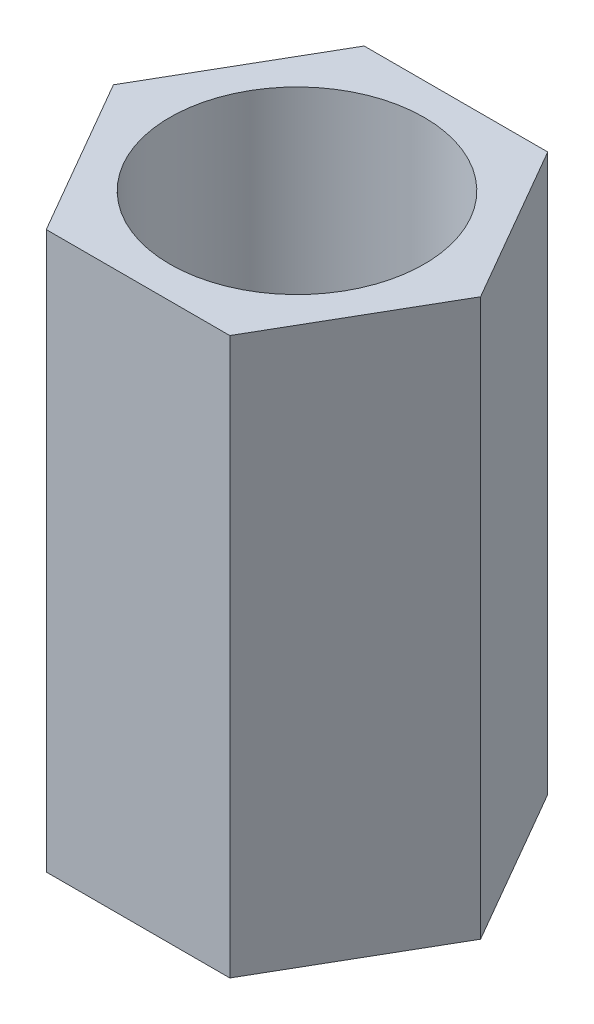
ISO-10303-21;
HEADER;
FILE_DESCRIPTION(('STEP AP214'),'2;1');
FILE_NAME('part.step','',(''),(''),'','','');
FILE_SCHEMA(('AUTOMOTIVE_DESIGN { 1 0 10303 214 1 1 1 1 }'));
ENDSEC;
DATA;
#1=APPLICATION_CONTEXT('core data for automotive mechanical design processes');
#2=APPLICATION_PROTOCOL_DEFINITION('international standard','automotive_design',2000,#1);
#3=PRODUCT_CONTEXT('',#1,'mechanical');
#4=PRODUCT('Part','Part','',(#3));
#5=PRODUCT_RELATED_PRODUCT_CATEGORY('part','',(#4));
#6=PRODUCT_DEFINITION_FORMATION('','',#4);
#7=PRODUCT_DEFINITION_CONTEXT('part definition',#1,'design');
#8=PRODUCT_DEFINITION('design','',#6,#7);
#9=PRODUCT_DEFINITION_SHAPE('','',#8);
#10=(LENGTH_UNIT() NAMED_UNIT(*) SI_UNIT(.MILLI.,.METRE.));
#11=(NAMED_UNIT(*) PLANE_ANGLE_UNIT() SI_UNIT($,.RADIAN.));
#12=(NAMED_UNIT(*) SI_UNIT($,.STERADIAN.) SOLID_ANGLE_UNIT());
#13=UNCERTAINTY_MEASURE_WITH_UNIT(LENGTH_MEASURE(1.E-05),#10,'distance_accuracy_value','');
#14=(GEOMETRIC_REPRESENTATION_CONTEXT(3) GLOBAL_UNCERTAINTY_ASSIGNED_CONTEXT((#13)) GLOBAL_UNIT_ASSIGNED_CONTEXT((#10,
#11,#12)) REPRESENTATION_CONTEXT('',''));
#15=CARTESIAN_POINT('',(0.,0.,0.));
#16=DIRECTION('',(0.,0.,1.));
#17=DIRECTION('',(1.,0.,0.));
#18=AXIS2_PLACEMENT_3D('',#15,#16,#17);
#19=CARTESIAN_POINT('',(0.,7.,0.));
#20=DIRECTION('',(0.,1.,0.));
#21=DIRECTION('',(0.,0.,1.));
#22=AXIS2_PLACEMENT_3D('',#19,#20,#21);
#23=PLANE('',#22);
#24=DIRECTION('',(0.5,0.,-0.866025403784439));
#25=VECTOR('',#24,1.);
#26=CARTESIAN_POINT('',(1.15470053837925,7.,2.));
#27=LINE('',#26,#25);
#28=CARTESIAN_POINT('',(1.15470053837925,7.,2.));
#29=VERTEX_POINT('',#28);
#30=CARTESIAN_POINT('',(2.3094010767585,7.,0.));
#31=VERTEX_POINT('',#30);
#32=EDGE_CURVE('E133',#29,#31,#27,.T.);
#33=ORIENTED_EDGE('',*,*,#32,.T.);
#34=DIRECTION('',(-0.5,0.,-0.866025403784439));
#35=VECTOR('',#34,1.);
#36=CARTESIAN_POINT('',(2.3094010767585,7.,0.));
#37=LINE('',#36,#35);
#38=CARTESIAN_POINT('',(1.15470053837925,7.,-2.));
#39=VERTEX_POINT('',#38);
#40=EDGE_CURVE('E91',#31,#39,#37,.T.);
#41=ORIENTED_EDGE('',*,*,#40,.T.);
#42=DIRECTION('',(-1.,0.,0.));
#43=VECTOR('',#42,1.);
#44=CARTESIAN_POINT('',(1.15470053837925,7.,-2.));
#45=LINE('',#44,#43);
#46=CARTESIAN_POINT('',(-1.15470053837925,7.,-2.));
#47=VERTEX_POINT('',#46);
#48=EDGE_CURVE('E104',#39,#47,#45,.T.);
#49=ORIENTED_EDGE('',*,*,#48,.T.);
#50=DIRECTION('',(-0.5,0.,0.866025403784439));
#51=VECTOR('',#50,1.);
#52=CARTESIAN_POINT('',(-1.15470053837925,7.,-2.));
#53=LINE('',#52,#51);
#54=CARTESIAN_POINT('',(-2.30940107675851,7.,0.));
#55=VERTEX_POINT('',#54);
#56=EDGE_CURVE('E98',#47,#55,#53,.T.);
#57=ORIENTED_EDGE('',*,*,#56,.T.);
#58=DIRECTION('',(0.5,0.,0.866025403784439));
#59=VECTOR('',#58,1.);
#60=CARTESIAN_POINT('',(-2.30940107675851,7.,0.));
#61=LINE('',#60,#59);
#62=CARTESIAN_POINT('',(-1.15470053837925,7.,2.));
#63=VERTEX_POINT('',#62);
#64=EDGE_CURVE('E102',#55,#63,#61,.T.);
#65=ORIENTED_EDGE('',*,*,#64,.T.);
#66=DIRECTION('',(1.,0.,0.));
#67=VECTOR('',#66,1.);
#68=CARTESIAN_POINT('',(-1.15470053837925,7.,2.));
#69=LINE('',#68,#67);
#70=EDGE_CURVE('E54',#63,#29,#69,.T.);
#71=ORIENTED_EDGE('',*,*,#70,.T.);
#72=EDGE_LOOP('',(#33,#41,#49,#57,#65,#71));
#73=FACE_BOUND('',#72,.T.);
#74=CARTESIAN_POINT('',(0.,7.,0.));
#75=DIRECTION('',(0.,1.,0.));
#76=DIRECTION('',(0.,0.,1.));
#77=AXIS2_PLACEMENT_3D('',#74,#75,#76);
#78=CIRCLE('',#77,1.6);
#79=CARTESIAN_POINT('',(0.,7.,1.6));
#80=VERTEX_POINT('',#79);
#81=EDGE_CURVE('E126',#80,#80,#78,.T.);
#82=ORIENTED_EDGE('',*,*,#81,.F.);
#83=EDGE_LOOP('',(#82));
#84=FACE_BOUND('',#83,.T.);
#85=ADVANCED_FACE('F37',(#73,#84),#23,.T.);
#86=CARTESIAN_POINT('',(0.,0.,0.));
#87=DIRECTION('',(0.,1.,0.));
#88=DIRECTION('',(0.,0.,1.));
#89=AXIS2_PLACEMENT_3D('',#86,#87,#88);
#90=PLANE('',#89);
#91=DIRECTION('',(0.5,0.,-0.866025403784439));
#92=VECTOR('',#91,1.);
#93=CARTESIAN_POINT('',(1.15470053837925,0.,2.));
#94=LINE('',#93,#92);
#95=CARTESIAN_POINT('',(1.15470053837925,0.,2.));
#96=VERTEX_POINT('',#95);
#97=CARTESIAN_POINT('',(2.3094010767585,0.,0.));
#98=VERTEX_POINT('',#97);
#99=EDGE_CURVE('E122',#96,#98,#94,.T.);
#100=ORIENTED_EDGE('',*,*,#99,.F.);
#101=DIRECTION('',(1.,0.,0.));
#102=VECTOR('',#101,1.);
#103=CARTESIAN_POINT('',(-1.15470053837925,0.,2.));
#104=LINE('',#103,#102);
#105=CARTESIAN_POINT('',(-1.15470053837925,0.,2.));
#106=VERTEX_POINT('',#105);
#107=EDGE_CURVE('E83',#106,#96,#104,.T.);
#108=ORIENTED_EDGE('',*,*,#107,.F.);
#109=DIRECTION('',(0.5,0.,0.866025403784439));
#110=VECTOR('',#109,1.);
#111=CARTESIAN_POINT('',(-2.30940107675851,0.,0.));
#112=LINE('',#111,#110);
#113=CARTESIAN_POINT('',(-2.30940107675851,0.,0.));
#114=VERTEX_POINT('',#113);
#115=EDGE_CURVE('E77',#114,#106,#112,.T.);
#116=ORIENTED_EDGE('',*,*,#115,.F.);
#117=DIRECTION('',(-0.5,0.,0.866025403784439));
#118=VECTOR('',#117,1.);
#119=CARTESIAN_POINT('',(-1.15470053837925,0.,-2.));
#120=LINE('',#119,#118);
#121=CARTESIAN_POINT('',(-1.15470053837925,0.,-2.));
#122=VERTEX_POINT('',#121);
#123=EDGE_CURVE('E112',#122,#114,#120,.T.);
#124=ORIENTED_EDGE('',*,*,#123,.F.);
#125=DIRECTION('',(-1.,0.,0.));
#126=VECTOR('',#125,1.);
#127=CARTESIAN_POINT('',(1.15470053837925,0.,-2.));
#128=LINE('',#127,#126);
#129=CARTESIAN_POINT('',(1.15470053837925,0.,-2.));
#130=VERTEX_POINT('',#129);
#131=EDGE_CURVE('E128',#130,#122,#128,.T.);
#132=ORIENTED_EDGE('',*,*,#131,.F.);
#133=DIRECTION('',(-0.5,0.,-0.866025403784439));
#134=VECTOR('',#133,1.);
#135=CARTESIAN_POINT('',(2.3094010767585,0.,0.));
#136=LINE('',#135,#134);
#137=EDGE_CURVE('E125',#98,#130,#136,.T.);
#138=ORIENTED_EDGE('',*,*,#137,.F.);
#139=EDGE_LOOP('',(#100,#108,#116,#124,#132,#138));
#140=FACE_BOUND('',#139,.T.);
#141=CARTESIAN_POINT('',(0.,0.,0.));
#142=DIRECTION('',(0.,1.,0.));
#143=DIRECTION('',(0.,0.,1.));
#144=AXIS2_PLACEMENT_3D('',#141,#142,#143);
#145=CIRCLE('',#144,1.6);
#146=CARTESIAN_POINT('',(0.,0.,1.6));
#147=VERTEX_POINT('',#146);
#148=EDGE_CURVE('E244',#147,#147,#145,.T.);
#149=ORIENTED_EDGE('',*,*,#148,.T.);
#150=EDGE_LOOP('',(#149));
#151=FACE_BOUND('',#150,.T.);
#152=ADVANCED_FACE('F142',(#140,#151),#90,.F.);
#153=CARTESIAN_POINT('',(1.15470053837925,7.,2.));
#154=DIRECTION('',(-0.866025403784439,0.,-0.5));
#155=DIRECTION('',(-0.5,0.,0.866025403784439));
#156=AXIS2_PLACEMENT_3D('',#153,#154,#155);
#157=PLANE('',#156);
#158=ORIENTED_EDGE('',*,*,#99,.T.);
#159=DIRECTION('',(0.,-1.,0.));
#160=VECTOR('',#159,1.);
#161=CARTESIAN_POINT('',(2.3094010767585,7.,0.));
#162=LINE('',#161,#160);
#163=EDGE_CURVE('E11',#31,#98,#162,.T.);
#164=ORIENTED_EDGE('',*,*,#163,.F.);
#165=ORIENTED_EDGE('',*,*,#32,.F.);
#166=DIRECTION('',(0.,-1.,0.));
#167=VECTOR('',#166,1.);
#168=CARTESIAN_POINT('',(1.15470053837925,7.,2.));
#169=LINE('',#168,#167);
#170=EDGE_CURVE('E118',#29,#96,#169,.T.);
#171=ORIENTED_EDGE('',*,*,#170,.T.);
#172=EDGE_LOOP('',(#158,#164,#165,#171));
#173=FACE_BOUND('',#172,.T.);
#174=ADVANCED_FACE('F39',(#173),#157,.F.);
#175=CARTESIAN_POINT('',(2.3094010767585,7.,0.));
#176=DIRECTION('',(-0.866025403784439,0.,0.5));
#177=DIRECTION('',(0.5,0.,0.866025403784439));
#178=AXIS2_PLACEMENT_3D('',#175,#176,#177);
#179=PLANE('',#178);
#180=ORIENTED_EDGE('',*,*,#137,.T.);
#181=DIRECTION('',(0.,-1.,0.));
#182=VECTOR('',#181,1.);
#183=CARTESIAN_POINT('',(1.15470053837925,7.,-2.));
#184=LINE('',#183,#182);
#185=EDGE_CURVE('E46',#39,#130,#184,.T.);
#186=ORIENTED_EDGE('',*,*,#185,.F.);
#187=ORIENTED_EDGE('',*,*,#40,.F.);
#188=ORIENTED_EDGE('',*,*,#163,.T.);
#189=EDGE_LOOP('',(#180,#186,#187,#188));
#190=FACE_BOUND('',#189,.T.);
#191=ADVANCED_FACE('F167',(#190),#179,.F.);
#192=CARTESIAN_POINT('',(1.15470053837925,7.,-2.));
#193=DIRECTION('',(0.,0.,1.));
#194=DIRECTION('',(1.,0.,0.));
#195=AXIS2_PLACEMENT_3D('',#192,#193,#194);
#196=PLANE('',#195);
#197=ORIENTED_EDGE('',*,*,#131,.T.);
#198=DIRECTION('',(0.,-1.,0.));
#199=VECTOR('',#198,1.);
#200=CARTESIAN_POINT('',(-1.15470053837925,7.,-2.));
#201=LINE('',#200,#199);
#202=EDGE_CURVE('E113',#47,#122,#201,.T.);
#203=ORIENTED_EDGE('',*,*,#202,.F.);
#204=ORIENTED_EDGE('',*,*,#48,.F.);
#205=ORIENTED_EDGE('',*,*,#185,.T.);
#206=EDGE_LOOP('',(#197,#203,#204,#205));
#207=FACE_BOUND('',#206,.T.);
#208=ADVANCED_FACE('F139',(#207),#196,.F.);
#209=CARTESIAN_POINT('',(-1.15470053837925,7.,-2.));
#210=DIRECTION('',(0.866025403784439,0.,0.5));
#211=DIRECTION('',(0.5,0.,-0.866025403784439));
#212=AXIS2_PLACEMENT_3D('',#209,#210,#211);
#213=PLANE('',#212);
#214=ORIENTED_EDGE('',*,*,#123,.T.);
#215=DIRECTION('',(0.,-1.,0.));
#216=VECTOR('',#215,1.);
#217=CARTESIAN_POINT('',(-2.30940107675851,7.,0.));
#218=LINE('',#217,#216);
#219=EDGE_CURVE('E109',#55,#114,#218,.T.);
#220=ORIENTED_EDGE('',*,*,#219,.F.);
#221=ORIENTED_EDGE('',*,*,#56,.F.);
#222=ORIENTED_EDGE('',*,*,#202,.T.);
#223=EDGE_LOOP('',(#214,#220,#221,#222));
#224=FACE_BOUND('',#223,.T.);
#225=ADVANCED_FACE('F110',(#224),#213,.F.);
#226=CARTESIAN_POINT('',(-2.30940107675851,7.,0.));
#227=DIRECTION('',(0.866025403784438,0.,-0.5));
#228=DIRECTION('',(-0.5,0.,-0.866025403784439));
#229=AXIS2_PLACEMENT_3D('',#226,#227,#228);
#230=PLANE('',#229);
#231=ORIENTED_EDGE('',*,*,#115,.T.);
#232=DIRECTION('',(0.,-1.,0.));
#233=VECTOR('',#232,1.);
#234=CARTESIAN_POINT('',(-1.15470053837925,7.,2.));
#235=LINE('',#234,#233);
#236=EDGE_CURVE('E114',#63,#106,#235,.T.);
#237=ORIENTED_EDGE('',*,*,#236,.F.);
#238=ORIENTED_EDGE('',*,*,#64,.F.);
#239=ORIENTED_EDGE('',*,*,#219,.T.);
#240=EDGE_LOOP('',(#231,#237,#238,#239));
#241=FACE_BOUND('',#240,.T.);
#242=ADVANCED_FACE('F116',(#241),#230,.F.);
#243=CARTESIAN_POINT('',(-1.15470053837925,7.,2.));
#244=DIRECTION('',(0.,0.,-1.));
#245=DIRECTION('',(-1.,0.,0.));
#246=AXIS2_PLACEMENT_3D('',#243,#244,#245);
#247=PLANE('',#246);
#248=ORIENTED_EDGE('',*,*,#107,.T.);
#249=ORIENTED_EDGE('',*,*,#170,.F.);
#250=ORIENTED_EDGE('',*,*,#70,.F.);
#251=ORIENTED_EDGE('',*,*,#236,.T.);
#252=EDGE_LOOP('',(#248,#249,#250,#251));
#253=FACE_BOUND('',#252,.T.);
#254=ADVANCED_FACE('F147',(#253),#247,.F.);
#255=CARTESIAN_POINT('',(0.,7.,0.));
#256=DIRECTION('',(0.,-1.,0.));
#257=DIRECTION('',(0.,0.,-1.));
#258=AXIS2_PLACEMENT_3D('',#255,#256,#257);
#259=CYLINDRICAL_SURFACE('',#258,1.6);
#260=ORIENTED_EDGE('',*,*,#81,.T.);
#261=EDGE_LOOP('',(#260));
#262=FACE_BOUND('',#261,.T.);
#263=ORIENTED_EDGE('',*,*,#148,.F.);
#264=EDGE_LOOP('',(#263));
#265=FACE_BOUND('',#264,.T.);
#266=ADVANCED_FACE('F149',(#262,#265),#259,.F.);
#267=CLOSED_SHELL('',(#85,#152,#174,#191,#208,#225,#242,#254,#266));
#268=MANIFOLD_SOLID_BREP('B2',#267);
#269=ADVANCED_BREP_SHAPE_REPRESENTATION('',(#18,#268),#14);
#270=SHAPE_DEFINITION_REPRESENTATION(#9,#269);
ENDSEC;
END-ISO-10303-21;
